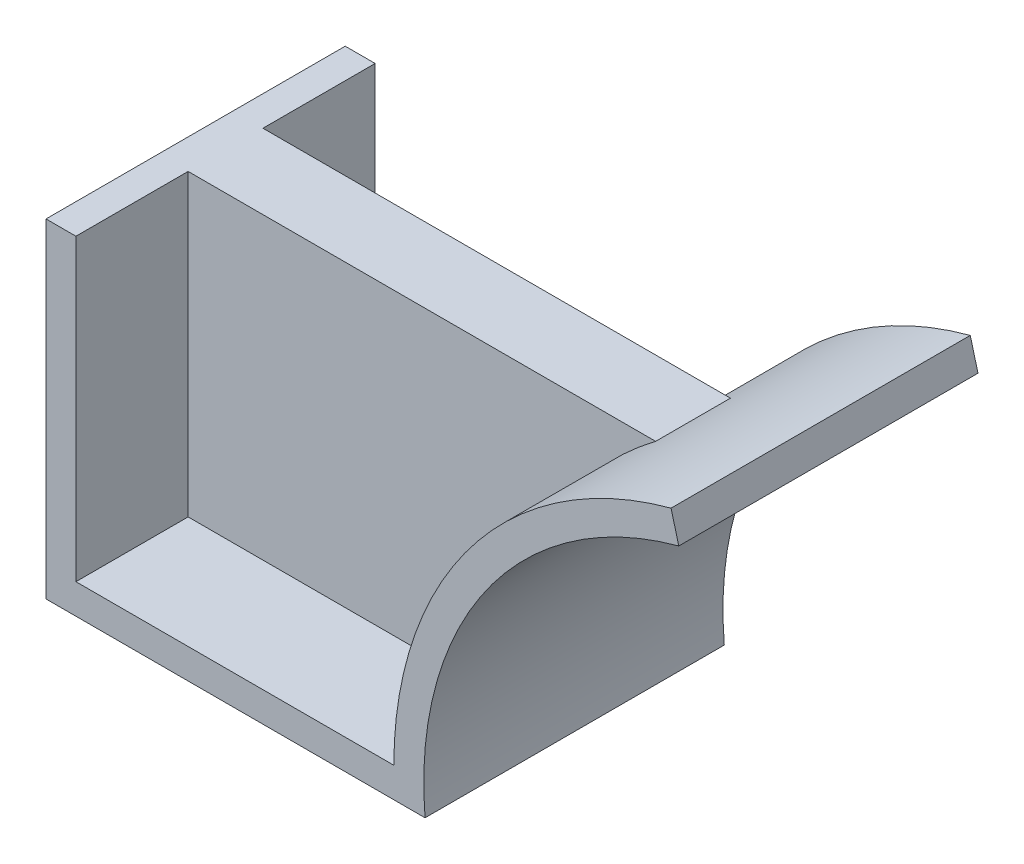
ISO-10303-21;
HEADER;
FILE_DESCRIPTION(('STEP AP214'),'2;1');
FILE_NAME('part.step','',(''),(''),'','','');
FILE_SCHEMA(('AUTOMOTIVE_DESIGN { 1 0 10303 214 1 1 1 1 }'));
ENDSEC;
DATA;
#1=APPLICATION_CONTEXT('core data for automotive mechanical design processes');
#2=APPLICATION_PROTOCOL_DEFINITION('international standard','automotive_design',2000,#1);
#3=PRODUCT_CONTEXT('',#1,'mechanical');
#4=PRODUCT('Part','Part','',(#3));
#5=PRODUCT_RELATED_PRODUCT_CATEGORY('part','',(#4));
#6=PRODUCT_DEFINITION_FORMATION('','',#4);
#7=PRODUCT_DEFINITION_CONTEXT('part definition',#1,'design');
#8=PRODUCT_DEFINITION('design','',#6,#7);
#9=PRODUCT_DEFINITION_SHAPE('','',#8);
#10=(LENGTH_UNIT() NAMED_UNIT(*) SI_UNIT(.MILLI.,.METRE.));
#11=(NAMED_UNIT(*) PLANE_ANGLE_UNIT() SI_UNIT($,.RADIAN.));
#12=(NAMED_UNIT(*) SI_UNIT($,.STERADIAN.) SOLID_ANGLE_UNIT());
#13=UNCERTAINTY_MEASURE_WITH_UNIT(LENGTH_MEASURE(1.E-05),#10,'distance_accuracy_value','');
#14=(GEOMETRIC_REPRESENTATION_CONTEXT(3) GLOBAL_UNCERTAINTY_ASSIGNED_CONTEXT((#13)) GLOBAL_UNIT_ASSIGNED_CONTEXT((#10,
#11,#12)) REPRESENTATION_CONTEXT('',''));
#15=CARTESIAN_POINT('',(0.,0.,0.));
#16=DIRECTION('',(0.,0.,1.));
#17=DIRECTION('',(1.,0.,0.));
#18=AXIS2_PLACEMENT_3D('',#15,#16,#17);
#19=CARTESIAN_POINT('',(185.,0.,80.));
#20=DIRECTION('',(0.,0.,-1.));
#21=DIRECTION('',(-1.,0.,0.));
#22=AXIS2_PLACEMENT_3D('',#19,#20,#21);
#23=CYLINDRICAL_SURFACE('',#22,100.);
#24=DIRECTION('',(0.,0.,-1.));
#25=VECTOR('',#24,1.);
#26=CARTESIAN_POINT('',(85.,0.,80.));
#27=LINE('',#26,#25);
#28=CARTESIAN_POINT('',(85.,0.,30.));
#29=VERTEX_POINT('',#28);
#30=CARTESIAN_POINT('',(85.,0.,0.));
#31=VERTEX_POINT('',#30);
#32=EDGE_CURVE('E171',#29,#31,#27,.T.);
#33=ORIENTED_EDGE('',*,*,#32,.F.);
#34=CARTESIAN_POINT('',(185.,0.,30.));
#35=DIRECTION('',(0.,0.,1.));
#36=DIRECTION('',(1.,0.,0.));
#37=AXIS2_PLACEMENT_3D('',#34,#35,#36);
#38=CIRCLE('',#37,100.);
#39=CARTESIAN_POINT('',(125.,80.,30.));
#40=VERTEX_POINT('',#39);
#41=EDGE_CURVE('E199',#40,#29,#38,.T.);
#42=ORIENTED_EDGE('',*,*,#41,.F.);
#43=DIRECTION('',(0.,0.,-1.));
#44=VECTOR('',#43,1.);
#45=CARTESIAN_POINT('',(125.,80.,80.));
#46=LINE('',#45,#44);
#47=CARTESIAN_POINT('',(125.,80.,50.));
#48=VERTEX_POINT('',#47);
#49=EDGE_CURVE('E227',#48,#40,#46,.T.);
#50=ORIENTED_EDGE('',*,*,#49,.F.);
#51=CARTESIAN_POINT('',(185.,0.,50.));
#52=DIRECTION('',(0.,0.,-1.));
#53=DIRECTION('',(-1.,0.,0.));
#54=AXIS2_PLACEMENT_3D('',#51,#52,#53);
#55=CIRCLE('',#54,100.);
#56=CARTESIAN_POINT('',(85.,0.,50.));
#57=VERTEX_POINT('',#56);
#58=EDGE_CURVE('E147',#57,#48,#55,.T.);
#59=ORIENTED_EDGE('',*,*,#58,.F.);
#60=CARTESIAN_POINT('',(85.,0.,80.));
#61=VERTEX_POINT('',#60);
#62=EDGE_CURVE('E172',#61,#57,#27,.T.);
#63=ORIENTED_EDGE('',*,*,#62,.F.);
#64=CARTESIAN_POINT('',(185.,0.,80.));
#65=DIRECTION('',(0.,0.,-1.));
#66=DIRECTION('',(-1.,0.,0.));
#67=AXIS2_PLACEMENT_3D('',#64,#65,#66);
#68=CIRCLE('',#67,100.);
#69=CARTESIAN_POINT('',(159.118095489748,96.5925826289069,80.));
#70=VERTEX_POINT('',#69);
#71=EDGE_CURVE('E180',#61,#70,#68,.T.);
#72=ORIENTED_EDGE('',*,*,#71,.T.);
#73=DIRECTION('',(0.,0.,-1.));
#74=VECTOR('',#73,1.);
#75=CARTESIAN_POINT('',(159.118095489748,96.5925826289069,80.));
#76=LINE('',#75,#74);
#77=CARTESIAN_POINT('',(159.118095489748,96.5925826289069,0.));
#78=VERTEX_POINT('',#77);
#79=EDGE_CURVE('E41',#70,#78,#76,.T.);
#80=ORIENTED_EDGE('',*,*,#79,.T.);
#81=CARTESIAN_POINT('',(185.,0.,0.));
#82=DIRECTION('',(0.,0.,-1.));
#83=DIRECTION('',(-1.,0.,0.));
#84=AXIS2_PLACEMENT_3D('',#81,#82,#83);
#85=CIRCLE('',#84,100.);
#86=EDGE_CURVE('E150',#31,#78,#85,.T.);
#87=ORIENTED_EDGE('',*,*,#86,.F.);
#88=EDGE_LOOP('',(#33,#42,#50,#59,#63,#72,#80,#87));
#89=FACE_BOUND('',#88,.T.);
#90=ADVANCED_FACE('F33',(#89),#23,.T.);
#91=CARTESIAN_POINT('',(0.,0.,80.));
#92=DIRECTION('',(0.,1.,0.));
#93=DIRECTION('',(0.,0.,1.));
#94=AXIS2_PLACEMENT_3D('',#91,#92,#93);
#95=PLANE('',#94);
#96=DIRECTION('',(0.,0.,-1.));
#97=VECTOR('',#96,1.);
#98=CARTESIAN_POINT('',(0.,0.,80.));
#99=LINE('',#98,#97);
#100=CARTESIAN_POINT('',(0.,0.,30.));
#101=VERTEX_POINT('',#100);
#102=CARTESIAN_POINT('',(0.,0.,0.));
#103=VERTEX_POINT('',#102);
#104=EDGE_CURVE('E167',#101,#103,#99,.T.);
#105=ORIENTED_EDGE('',*,*,#104,.F.);
#106=DIRECTION('',(-1.,0.,0.));
#107=VECTOR('',#106,1.);
#108=CARTESIAN_POINT('',(161.189647850568,0.,30.));
#109=LINE('',#108,#107);
#110=EDGE_CURVE('E194',#29,#101,#109,.T.);
#111=ORIENTED_EDGE('',*,*,#110,.F.);
#112=ORIENTED_EDGE('',*,*,#32,.T.);
#113=DIRECTION('',(1.,0.,0.));
#114=VECTOR('',#113,1.);
#115=CARTESIAN_POINT('',(0.,0.,0.));
#116=LINE('',#115,#114);
#117=EDGE_CURVE('E153',#103,#31,#116,.T.);
#118=ORIENTED_EDGE('',*,*,#117,.F.);
#119=EDGE_LOOP('',(#105,#111,#112,#118));
#120=FACE_BOUND('',#119,.T.);
#121=ADVANCED_FACE('F191',(#120),#95,.T.);
#122=ORIENTED_EDGE('',*,*,#62,.T.);
#123=DIRECTION('',(-1.,0.,0.));
#124=VECTOR('',#123,1.);
#125=CARTESIAN_POINT('',(161.189647850568,0.,50.));
#126=LINE('',#125,#124);
#127=CARTESIAN_POINT('',(0.,0.,50.));
#128=VERTEX_POINT('',#127);
#129=EDGE_CURVE('E220',#57,#128,#126,.T.);
#130=ORIENTED_EDGE('',*,*,#129,.T.);
#131=CARTESIAN_POINT('',(0.,0.,80.));
#132=VERTEX_POINT('',#131);
#133=EDGE_CURVE('E168',#132,#128,#99,.T.);
#134=ORIENTED_EDGE('',*,*,#133,.F.);
#135=DIRECTION('',(1.,0.,0.));
#136=VECTOR('',#135,1.);
#137=CARTESIAN_POINT('',(0.,0.,80.));
#138=LINE('',#137,#136);
#139=EDGE_CURVE('E137',#132,#61,#138,.T.);
#140=ORIENTED_EDGE('',*,*,#139,.T.);
#141=EDGE_LOOP('',(#122,#130,#134,#140));
#142=FACE_BOUND('',#141,.T.);
#143=ADVANCED_FACE('F225',(#142),#95,.T.);
#144=CARTESIAN_POINT('',(0.,80.,80.));
#145=DIRECTION('',(1.,0.,0.));
#146=DIRECTION('',(0.,0.,-1.));
#147=AXIS2_PLACEMENT_3D('',#144,#145,#146);
#148=PLANE('',#147);
#149=DIRECTION('',(0.,0.,-1.));
#150=VECTOR('',#149,1.);
#151=CARTESIAN_POINT('',(0.,80.,80.));
#152=LINE('',#151,#150);
#153=CARTESIAN_POINT('',(0.,80.,30.));
#154=VERTEX_POINT('',#153);
#155=CARTESIAN_POINT('',(0.,80.,0.));
#156=VERTEX_POINT('',#155);
#157=EDGE_CURVE('E124',#154,#156,#152,.T.);
#158=ORIENTED_EDGE('',*,*,#157,.F.);
#159=DIRECTION('',(0.,1.,0.));
#160=VECTOR('',#159,1.);
#161=CARTESIAN_POINT('',(0.,80.,30.));
#162=LINE('',#161,#160);
#163=EDGE_CURVE('E48',#101,#154,#162,.T.);
#164=ORIENTED_EDGE('',*,*,#163,.F.);
#165=ORIENTED_EDGE('',*,*,#104,.T.);
#166=DIRECTION('',(0.,-1.,0.));
#167=VECTOR('',#166,1.);
#168=CARTESIAN_POINT('',(0.,80.,0.));
#169=LINE('',#168,#167);
#170=EDGE_CURVE('E156',#156,#103,#169,.T.);
#171=ORIENTED_EDGE('',*,*,#170,.F.);
#172=EDGE_LOOP('',(#158,#164,#165,#171));
#173=FACE_BOUND('',#172,.T.);
#174=ADVANCED_FACE('F245',(#173),#148,.T.);
#175=ORIENTED_EDGE('',*,*,#133,.T.);
#176=DIRECTION('',(0.,-1.,0.));
#177=VECTOR('',#176,1.);
#178=CARTESIAN_POINT('',(0.,80.,50.));
#179=LINE('',#178,#177);
#180=CARTESIAN_POINT('',(0.,80.,50.));
#181=VERTEX_POINT('',#180);
#182=EDGE_CURVE('E217',#181,#128,#179,.T.);
#183=ORIENTED_EDGE('',*,*,#182,.F.);
#184=CARTESIAN_POINT('',(0.,80.,80.));
#185=VERTEX_POINT('',#184);
#186=EDGE_CURVE('E165',#185,#181,#152,.T.);
#187=ORIENTED_EDGE('',*,*,#186,.F.);
#188=DIRECTION('',(0.,-1.,0.));
#189=VECTOR('',#188,1.);
#190=CARTESIAN_POINT('',(0.,80.,80.));
#191=LINE('',#190,#189);
#192=EDGE_CURVE('E135',#185,#132,#191,.T.);
#193=ORIENTED_EDGE('',*,*,#192,.T.);
#194=EDGE_LOOP('',(#175,#183,#187,#193));
#195=FACE_BOUND('',#194,.T.);
#196=ADVANCED_FACE('F229',(#195),#148,.T.);
#197=CARTESIAN_POINT('',(185.,0.,80.));
#198=DIRECTION('',(0.,0.,-1.));
#199=DIRECTION('',(-1.,0.,0.));
#200=AXIS2_PLACEMENT_3D('',#197,#198,#199);
#201=CYLINDRICAL_SURFACE('',#200,92.);
#202=CARTESIAN_POINT('',(185.,0.,0.));
#203=DIRECTION('',(0.,0.,1.));
#204=DIRECTION('',(1.,0.,0.));
#205=AXIS2_PLACEMENT_3D('',#202,#203,#204);
#206=CIRCLE('',#205,92.);
#207=CARTESIAN_POINT('',(93.3484861008832,-8.,0.));
#208=VERTEX_POINT('',#207);
#209=CARTESIAN_POINT('',(161.188647850568,88.8651760185943,0.));
#210=VERTEX_POINT('',#209);
#211=EDGE_CURVE('E143',#208,#210,#206,.F.);
#212=ORIENTED_EDGE('',*,*,#211,.T.);
#213=DIRECTION('',(0.,0.,-1.));
#214=VECTOR('',#213,1.);
#215=CARTESIAN_POINT('',(161.188647850568,88.8651760185943,80.));
#216=LINE('',#215,#214);
#217=CARTESIAN_POINT('',(161.188647850568,88.8651760185943,80.));
#218=VERTEX_POINT('',#217);
#219=EDGE_CURVE('E11',#218,#210,#216,.T.);
#220=ORIENTED_EDGE('',*,*,#219,.F.);
#221=CARTESIAN_POINT('',(185.,0.,80.));
#222=DIRECTION('',(0.,0.,1.));
#223=DIRECTION('',(1.,0.,0.));
#224=AXIS2_PLACEMENT_3D('',#221,#222,#223);
#225=CIRCLE('',#224,92.);
#226=CARTESIAN_POINT('',(93.3484861008832,-8.,80.));
#227=VERTEX_POINT('',#226);
#228=EDGE_CURVE('E95',#227,#218,#225,.F.);
#229=ORIENTED_EDGE('',*,*,#228,.F.);
#230=DIRECTION('',(0.,0.,-1.));
#231=VECTOR('',#230,1.);
#232=CARTESIAN_POINT('',(93.3484861008832,-8.,80.));
#233=LINE('',#232,#231);
#234=EDGE_CURVE('E142',#227,#208,#233,.T.);
#235=ORIENTED_EDGE('',*,*,#234,.T.);
#236=EDGE_LOOP('',(#212,#220,#229,#235));
#237=FACE_BOUND('',#236,.T.);
#238=ADVANCED_FACE('F35',(#237),#201,.F.);
#239=CARTESIAN_POINT('',(159.118095489748,96.5925826289069,80.));
#240=DIRECTION('',(0.96592582628907,0.258819045102515,0.));
#241=DIRECTION('',(-0.258819045102515,0.96592582628907,0.));
#242=AXIS2_PLACEMENT_3D('',#239,#240,#241);
#243=PLANE('',#242);
#244=DIRECTION('',(0.258819045102515,-0.96592582628907,0.));
#245=VECTOR('',#244,1.);
#246=CARTESIAN_POINT('',(159.118095489748,96.5925826289069,0.));
#247=LINE('',#246,#245);
#248=EDGE_CURVE('E146',#78,#210,#247,.T.);
#249=ORIENTED_EDGE('',*,*,#248,.F.);
#250=ORIENTED_EDGE('',*,*,#79,.F.);
#251=DIRECTION('',(0.258819045102515,-0.96592582628907,0.));
#252=VECTOR('',#251,1.);
#253=CARTESIAN_POINT('',(159.118095489748,96.5925826289069,80.));
#254=LINE('',#253,#252);
#255=EDGE_CURVE('E238',#70,#218,#254,.T.);
#256=ORIENTED_EDGE('',*,*,#255,.T.);
#257=ORIENTED_EDGE('',*,*,#219,.T.);
#258=EDGE_LOOP('',(#249,#250,#256,#257));
#259=FACE_BOUND('',#258,.T.);
#260=ADVANCED_FACE('F183',(#259),#243,.T.);
#261=CARTESIAN_POINT('',(-8.,80.,80.));
#262=DIRECTION('',(0.,1.,0.));
#263=DIRECTION('',(0.,0.,1.));
#264=AXIS2_PLACEMENT_3D('',#261,#262,#263);
#265=PLANE('',#264);
#266=DIRECTION('',(1.,0.,0.));
#267=VECTOR('',#266,1.);
#268=CARTESIAN_POINT('',(-8.,80.,0.));
#269=LINE('',#268,#267);
#270=CARTESIAN_POINT('',(-8.,80.,0.));
#271=VERTEX_POINT('',#270);
#272=EDGE_CURVE('E121',#271,#156,#269,.T.);
#273=ORIENTED_EDGE('',*,*,#272,.F.);
#274=DIRECTION('',(0.,0.,-1.));
#275=VECTOR('',#274,1.);
#276=CARTESIAN_POINT('',(-8.,80.,80.));
#277=LINE('',#276,#275);
#278=CARTESIAN_POINT('',(-8.,80.,80.));
#279=VERTEX_POINT('',#278);
#280=EDGE_CURVE('E114',#279,#271,#277,.T.);
#281=ORIENTED_EDGE('',*,*,#280,.F.);
#282=DIRECTION('',(1.,0.,0.));
#283=VECTOR('',#282,1.);
#284=CARTESIAN_POINT('',(-8.,80.,80.));
#285=LINE('',#284,#283);
#286=EDGE_CURVE('E119',#279,#185,#285,.T.);
#287=ORIENTED_EDGE('',*,*,#286,.T.);
#288=ORIENTED_EDGE('',*,*,#186,.T.);
#289=DIRECTION('',(-1.,0.,0.));
#290=VECTOR('',#289,1.);
#291=CARTESIAN_POINT('',(161.189647850568,80.,50.));
#292=LINE('',#291,#290);
#293=EDGE_CURVE('E221',#48,#181,#292,.T.);
#294=ORIENTED_EDGE('',*,*,#293,.F.);
#295=ORIENTED_EDGE('',*,*,#49,.T.);
#296=DIRECTION('',(-1.,0.,0.));
#297=VECTOR('',#296,1.);
#298=CARTESIAN_POINT('',(161.189647850568,80.,30.));
#299=LINE('',#298,#297);
#300=EDGE_CURVE('E231',#40,#154,#299,.T.);
#301=ORIENTED_EDGE('',*,*,#300,.T.);
#302=ORIENTED_EDGE('',*,*,#157,.T.);
#303=EDGE_LOOP('',(#273,#281,#287,#288,#294,#295,#301,#302));
#304=FACE_BOUND('',#303,.T.);
#305=ADVANCED_FACE('F116',(#304),#265,.T.);
#306=CARTESIAN_POINT('',(-8.,80.,80.));
#307=DIRECTION('',(1.,0.,0.));
#308=DIRECTION('',(0.,0.,-1.));
#309=AXIS2_PLACEMENT_3D('',#306,#307,#308);
#310=PLANE('',#309);
#311=DIRECTION('',(0.,1.,0.));
#312=VECTOR('',#311,1.);
#313=CARTESIAN_POINT('',(-8.,80.,0.));
#314=LINE('',#313,#312);
#315=CARTESIAN_POINT('',(-8.,-8.,0.));
#316=VERTEX_POINT('',#315);
#317=EDGE_CURVE('E160',#271,#316,#314,.F.);
#318=ORIENTED_EDGE('',*,*,#317,.T.);
#319=DIRECTION('',(0.,0.,-1.));
#320=VECTOR('',#319,1.);
#321=CARTESIAN_POINT('',(-8.,-8.,80.));
#322=LINE('',#321,#320);
#323=CARTESIAN_POINT('',(-8.,-8.,80.));
#324=VERTEX_POINT('',#323);
#325=EDGE_CURVE('E125',#324,#316,#322,.T.);
#326=ORIENTED_EDGE('',*,*,#325,.F.);
#327=DIRECTION('',(0.,1.,0.));
#328=VECTOR('',#327,1.);
#329=CARTESIAN_POINT('',(-8.,80.,80.));
#330=LINE('',#329,#328);
#331=EDGE_CURVE('E128',#279,#324,#330,.F.);
#332=ORIENTED_EDGE('',*,*,#331,.F.);
#333=ORIENTED_EDGE('',*,*,#280,.T.);
#334=EDGE_LOOP('',(#318,#326,#332,#333));
#335=FACE_BOUND('',#334,.T.);
#336=ADVANCED_FACE('F129',(#335),#310,.F.);
#337=CARTESIAN_POINT('',(0.,-8.,80.));
#338=DIRECTION('',(0.,1.,0.));
#339=DIRECTION('',(0.,0.,1.));
#340=AXIS2_PLACEMENT_3D('',#337,#338,#339);
#341=PLANE('',#340);
#342=DIRECTION('',(1.,0.,0.));
#343=VECTOR('',#342,1.);
#344=CARTESIAN_POINT('',(0.,-8.,0.));
#345=LINE('',#344,#343);
#346=EDGE_CURVE('E89',#316,#208,#345,.T.);
#347=ORIENTED_EDGE('',*,*,#346,.T.);
#348=ORIENTED_EDGE('',*,*,#234,.F.);
#349=DIRECTION('',(1.,0.,0.));
#350=VECTOR('',#349,1.);
#351=CARTESIAN_POINT('',(0.,-8.,80.));
#352=LINE('',#351,#350);
#353=EDGE_CURVE('E57',#324,#227,#352,.T.);
#354=ORIENTED_EDGE('',*,*,#353,.F.);
#355=ORIENTED_EDGE('',*,*,#325,.T.);
#356=EDGE_LOOP('',(#347,#348,#354,#355));
#357=FACE_BOUND('',#356,.T.);
#358=ADVANCED_FACE('F246',(#357),#341,.F.);
#359=CARTESIAN_POINT('',(185.,0.,80.));
#360=DIRECTION('',(0.,0.,1.));
#361=DIRECTION('',(1.,0.,0.));
#362=AXIS2_PLACEMENT_3D('',#359,#360,#361);
#363=PLANE('',#362);
#364=ORIENTED_EDGE('',*,*,#228,.T.);
#365=ORIENTED_EDGE('',*,*,#255,.F.);
#366=ORIENTED_EDGE('',*,*,#71,.F.);
#367=ORIENTED_EDGE('',*,*,#139,.F.);
#368=ORIENTED_EDGE('',*,*,#192,.F.);
#369=ORIENTED_EDGE('',*,*,#286,.F.);
#370=ORIENTED_EDGE('',*,*,#331,.T.);
#371=ORIENTED_EDGE('',*,*,#353,.T.);
#372=EDGE_LOOP('',(#364,#365,#366,#367,#368,#369,#370,#371));
#373=FACE_BOUND('',#372,.T.);
#374=ADVANCED_FACE('F132',(#373),#363,.T.);
#375=CARTESIAN_POINT('',(185.,0.,0.));
#376=DIRECTION('',(0.,0.,1.));
#377=DIRECTION('',(1.,0.,0.));
#378=AXIS2_PLACEMENT_3D('',#375,#376,#377);
#379=PLANE('',#378);
#380=ORIENTED_EDGE('',*,*,#211,.F.);
#381=ORIENTED_EDGE('',*,*,#346,.F.);
#382=ORIENTED_EDGE('',*,*,#317,.F.);
#383=ORIENTED_EDGE('',*,*,#272,.T.);
#384=ORIENTED_EDGE('',*,*,#170,.T.);
#385=ORIENTED_EDGE('',*,*,#117,.T.);
#386=ORIENTED_EDGE('',*,*,#86,.T.);
#387=ORIENTED_EDGE('',*,*,#248,.T.);
#388=EDGE_LOOP('',(#380,#381,#382,#383,#384,#385,#386,#387));
#389=FACE_BOUND('',#388,.T.);
#390=ADVANCED_FACE('F186',(#389),#379,.F.);
#391=CARTESIAN_POINT('',(161.189647850568,80.,30.));
#392=DIRECTION('',(0.,0.,1.));
#393=DIRECTION('',(1.,0.,0.));
#394=AXIS2_PLACEMENT_3D('',#391,#392,#393);
#395=PLANE('',#394);
#396=ORIENTED_EDGE('',*,*,#300,.F.);
#397=ORIENTED_EDGE('',*,*,#41,.T.);
#398=ORIENTED_EDGE('',*,*,#110,.T.);
#399=ORIENTED_EDGE('',*,*,#163,.T.);
#400=EDGE_LOOP('',(#396,#397,#398,#399));
#401=FACE_BOUND('',#400,.T.);
#402=ADVANCED_FACE('F270',(#401),#395,.F.);
#403=CARTESIAN_POINT('',(161.189647850568,80.,50.));
#404=DIRECTION('',(0.,0.,-1.));
#405=DIRECTION('',(-1.,0.,0.));
#406=AXIS2_PLACEMENT_3D('',#403,#404,#405);
#407=PLANE('',#406);
#408=ORIENTED_EDGE('',*,*,#129,.F.);
#409=ORIENTED_EDGE('',*,*,#58,.T.);
#410=ORIENTED_EDGE('',*,*,#293,.T.);
#411=ORIENTED_EDGE('',*,*,#182,.T.);
#412=EDGE_LOOP('',(#408,#409,#410,#411));
#413=FACE_BOUND('',#412,.T.);
#414=ADVANCED_FACE('F219',(#413),#407,.F.);
#415=CLOSED_SHELL('',(#90,#121,#143,#174,#196,#238,#260,#305,#336,#358,#374,#390,#402,#414));
#416=MANIFOLD_SOLID_BREP('B2',#415);
#417=ADVANCED_BREP_SHAPE_REPRESENTATION('',(#18,#416),#14);
#418=SHAPE_DEFINITION_REPRESENTATION(#9,#417);
ENDSEC;
END-ISO-10303-21;
